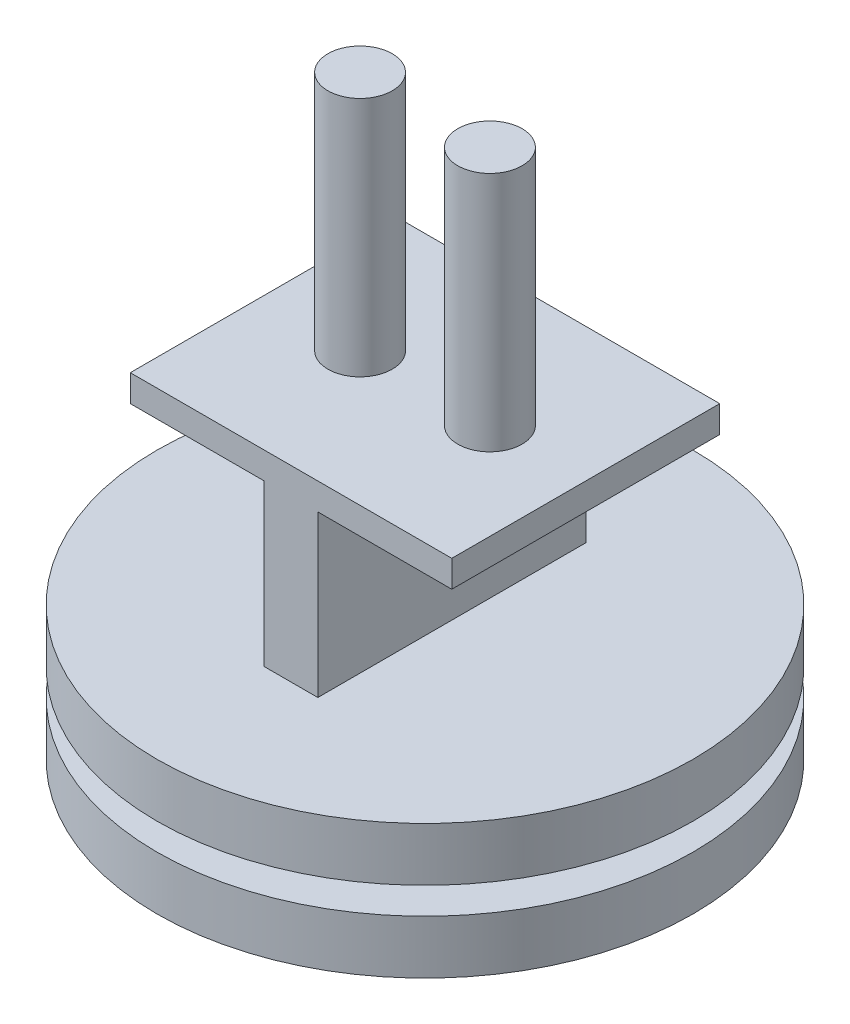
ISO-10303-21;
HEADER;
FILE_DESCRIPTION(('STEP AP214'),'2;1');
FILE_NAME('part.step','',(''),(''),'','','');
FILE_SCHEMA(('AUTOMOTIVE_DESIGN { 1 0 10303 214 1 1 1 1 }'));
ENDSEC;
DATA;
#1=APPLICATION_CONTEXT('core data for automotive mechanical design processes');
#2=APPLICATION_PROTOCOL_DEFINITION('international standard','automotive_design',2000,#1);
#3=PRODUCT_CONTEXT('',#1,'mechanical');
#4=PRODUCT('Part','Part','',(#3));
#5=PRODUCT_RELATED_PRODUCT_CATEGORY('part','',(#4));
#6=PRODUCT_DEFINITION_FORMATION('','',#4);
#7=PRODUCT_DEFINITION_CONTEXT('part definition',#1,'design');
#8=PRODUCT_DEFINITION('design','',#6,#7);
#9=PRODUCT_DEFINITION_SHAPE('','',#8);
#10=(LENGTH_UNIT() NAMED_UNIT(*) SI_UNIT(.MILLI.,.METRE.));
#11=(NAMED_UNIT(*) PLANE_ANGLE_UNIT() SI_UNIT($,.RADIAN.));
#12=(NAMED_UNIT(*) SI_UNIT($,.STERADIAN.) SOLID_ANGLE_UNIT());
#13=UNCERTAINTY_MEASURE_WITH_UNIT(LENGTH_MEASURE(1.E-05),#10,'distance_accuracy_value','');
#14=(GEOMETRIC_REPRESENTATION_CONTEXT(3) GLOBAL_UNCERTAINTY_ASSIGNED_CONTEXT((#13)) GLOBAL_UNIT_ASSIGNED_CONTEXT((#10,
#11,#12)) REPRESENTATION_CONTEXT('',''));
#15=CARTESIAN_POINT('',(0.,0.,0.));
#16=DIRECTION('',(0.,0.,1.));
#17=DIRECTION('',(1.,0.,0.));
#18=AXIS2_PLACEMENT_3D('',#15,#16,#17);
#19=CARTESIAN_POINT('',(0.,10.,0.));
#20=DIRECTION('',(0.,-1.,0.));
#21=DIRECTION('',(0.,0.,-1.));
#22=AXIS2_PLACEMENT_3D('',#19,#20,#21);
#23=CYLINDRICAL_SURFACE('',#22,50.);
#24=CARTESIAN_POINT('',(0.,10.,0.));
#25=DIRECTION('',(0.,1.,0.));
#26=DIRECTION('',(0.,0.,1.));
#27=AXIS2_PLACEMENT_3D('',#24,#25,#26);
#28=CIRCLE('',#27,50.);
#29=CARTESIAN_POINT('',(0.,10.,50.));
#30=VERTEX_POINT('',#29);
#31=EDGE_CURVE('E189',#30,#30,#28,.T.);
#32=ORIENTED_EDGE('',*,*,#31,.F.);
#33=EDGE_LOOP('',(#32));
#34=FACE_BOUND('',#33,.T.);
#35=CARTESIAN_POINT('',(0.,0.,0.));
#36=DIRECTION('',(0.,1.,0.));
#37=DIRECTION('',(0.,0.,1.));
#38=AXIS2_PLACEMENT_3D('',#35,#36,#37);
#39=CIRCLE('',#38,50.);
#40=CARTESIAN_POINT('',(0.,0.,50.));
#41=VERTEX_POINT('',#40);
#42=EDGE_CURVE('E184',#41,#41,#39,.T.);
#43=ORIENTED_EDGE('',*,*,#42,.T.);
#44=EDGE_LOOP('',(#43));
#45=FACE_BOUND('',#44,.T.);
#46=ADVANCED_FACE('F39',(#34,#45),#23,.T.);
#47=CARTESIAN_POINT('',(0.,10.,0.));
#48=DIRECTION('',(0.,1.,0.));
#49=DIRECTION('',(0.,0.,1.));
#50=AXIS2_PLACEMENT_3D('',#47,#48,#49);
#51=PLANE('',#50);
#52=CARTESIAN_POINT('',(0.,10.,0.));
#53=DIRECTION('',(0.,1.,0.));
#54=DIRECTION('',(0.,0.,1.));
#55=AXIS2_PLACEMENT_3D('',#52,#53,#54);
#56=CIRCLE('',#55,10.);
#57=CARTESIAN_POINT('',(0.,10.,10.));
#58=VERTEX_POINT('',#57);
#59=EDGE_CURVE('E185',#58,#58,#56,.T.);
#60=ORIENTED_EDGE('',*,*,#59,.F.);
#61=EDGE_LOOP('',(#60));
#62=FACE_BOUND('',#61,.T.);
#63=ORIENTED_EDGE('',*,*,#31,.T.);
#64=EDGE_LOOP('',(#63));
#65=FACE_BOUND('',#64,.T.);
#66=ADVANCED_FACE('F218',(#62,#65),#51,.T.);
#67=CARTESIAN_POINT('',(0.,0.,0.));
#68=DIRECTION('',(0.,1.,0.));
#69=DIRECTION('',(0.,0.,1.));
#70=AXIS2_PLACEMENT_3D('',#67,#68,#69);
#71=PLANE('',#70);
#72=ORIENTED_EDGE('',*,*,#42,.F.);
#73=EDGE_LOOP('',(#72));
#74=FACE_BOUND('',#73,.T.);
#75=ADVANCED_FACE('F223',(#74),#71,.F.);
#76=CARTESIAN_POINT('',(0.,15.,0.));
#77=DIRECTION('',(0.,-1.,0.));
#78=DIRECTION('',(0.,0.,-1.));
#79=AXIS2_PLACEMENT_3D('',#76,#77,#78);
#80=CYLINDRICAL_SURFACE('',#79,10.);
#81=CARTESIAN_POINT('',(0.,15.,0.));
#82=DIRECTION('',(0.,1.,0.));
#83=DIRECTION('',(0.,0.,1.));
#84=AXIS2_PLACEMENT_3D('',#81,#82,#83);
#85=CIRCLE('',#84,10.);
#86=CARTESIAN_POINT('',(0.,15.,10.));
#87=VERTEX_POINT('',#86);
#88=EDGE_CURVE('E177',#87,#87,#85,.T.);
#89=ORIENTED_EDGE('',*,*,#88,.F.);
#90=EDGE_LOOP('',(#89));
#91=FACE_BOUND('',#90,.T.);
#92=ORIENTED_EDGE('',*,*,#59,.T.);
#93=EDGE_LOOP('',(#92));
#94=FACE_BOUND('',#93,.T.);
#95=ADVANCED_FACE('F231',(#91,#94),#80,.T.);
#96=CARTESIAN_POINT('',(0.,25.,0.));
#97=DIRECTION('',(0.,-1.,0.));
#98=DIRECTION('',(0.,0.,-1.));
#99=AXIS2_PLACEMENT_3D('',#96,#97,#98);
#100=CYLINDRICAL_SURFACE('',#99,50.);
#101=CARTESIAN_POINT('',(0.,25.,0.));
#102=DIRECTION('',(0.,1.,0.));
#103=DIRECTION('',(0.,0.,1.));
#104=AXIS2_PLACEMENT_3D('',#101,#102,#103);
#105=CIRCLE('',#104,50.);
#106=CARTESIAN_POINT('',(0.,25.,50.));
#107=VERTEX_POINT('',#106);
#108=EDGE_CURVE('E173',#107,#107,#105,.T.);
#109=ORIENTED_EDGE('',*,*,#108,.F.);
#110=EDGE_LOOP('',(#109));
#111=FACE_BOUND('',#110,.T.);
#112=CARTESIAN_POINT('',(0.,15.,0.));
#113=DIRECTION('',(0.,1.,0.));
#114=DIRECTION('',(0.,0.,1.));
#115=AXIS2_PLACEMENT_3D('',#112,#113,#114);
#116=CIRCLE('',#115,50.);
#117=CARTESIAN_POINT('',(0.,15.,50.));
#118=VERTEX_POINT('',#117);
#119=EDGE_CURVE('E172',#118,#118,#116,.T.);
#120=ORIENTED_EDGE('',*,*,#119,.T.);
#121=EDGE_LOOP('',(#120));
#122=FACE_BOUND('',#121,.T.);
#123=ADVANCED_FACE('F235',(#111,#122),#100,.T.);
#124=CARTESIAN_POINT('',(0.,25.,0.));
#125=DIRECTION('',(0.,1.,0.));
#126=DIRECTION('',(0.,0.,1.));
#127=AXIS2_PLACEMENT_3D('',#124,#125,#126);
#128=PLANE('',#127);
#129=DIRECTION('',(0.,0.,-1.));
#130=VECTOR('',#129,1.);
#131=CARTESIAN_POINT('',(5.,25.,-25.));
#132=LINE('',#131,#130);
#133=CARTESIAN_POINT('',(5.,25.,25.));
#134=VERTEX_POINT('',#133);
#135=CARTESIAN_POINT('',(5.,25.,-25.));
#136=VERTEX_POINT('',#135);
#137=EDGE_CURVE('E54',#134,#136,#132,.T.);
#138=ORIENTED_EDGE('',*,*,#137,.F.);
#139=DIRECTION('',(1.,0.,0.));
#140=VECTOR('',#139,1.);
#141=CARTESIAN_POINT('',(-4.99999999999999,25.,25.));
#142=LINE('',#141,#140);
#143=CARTESIAN_POINT('',(-4.99999999999999,25.,25.));
#144=VERTEX_POINT('',#143);
#145=EDGE_CURVE('E58',#144,#134,#142,.T.);
#146=ORIENTED_EDGE('',*,*,#145,.F.);
#147=DIRECTION('',(0.,0.,1.));
#148=VECTOR('',#147,1.);
#149=CARTESIAN_POINT('',(-5.,25.,-25.));
#150=LINE('',#149,#148);
#151=CARTESIAN_POINT('',(-5.,25.,-25.));
#152=VERTEX_POINT('',#151);
#153=EDGE_CURVE('E152',#152,#144,#150,.T.);
#154=ORIENTED_EDGE('',*,*,#153,.F.);
#155=DIRECTION('',(-1.,0.,0.));
#156=VECTOR('',#155,1.);
#157=CARTESIAN_POINT('',(-5.,25.,-25.));
#158=LINE('',#157,#156);
#159=EDGE_CURVE('E135',#136,#152,#158,.T.);
#160=ORIENTED_EDGE('',*,*,#159,.F.);
#161=EDGE_LOOP('',(#138,#146,#154,#160));
#162=FACE_BOUND('',#161,.T.);
#163=ORIENTED_EDGE('',*,*,#108,.T.);
#164=EDGE_LOOP('',(#163));
#165=FACE_BOUND('',#164,.T.);
#166=ADVANCED_FACE('F241',(#162,#165),#128,.T.);
#167=CARTESIAN_POINT('',(0.,15.,0.));
#168=DIRECTION('',(0.,1.,0.));
#169=DIRECTION('',(0.,0.,1.));
#170=AXIS2_PLACEMENT_3D('',#167,#168,#169);
#171=PLANE('',#170);
#172=ORIENTED_EDGE('',*,*,#88,.T.);
#173=EDGE_LOOP('',(#172));
#174=FACE_BOUND('',#173,.T.);
#175=ORIENTED_EDGE('',*,*,#119,.F.);
#176=EDGE_LOOP('',(#175));
#177=FACE_BOUND('',#176,.T.);
#178=ADVANCED_FACE('F243',(#174,#177),#171,.F.);
#179=CARTESIAN_POINT('',(5.,55.,-25.));
#180=DIRECTION('',(-1.,0.,0.));
#181=DIRECTION('',(0.,0.,1.));
#182=AXIS2_PLACEMENT_3D('',#179,#180,#181);
#183=PLANE('',#182);
#184=ORIENTED_EDGE('',*,*,#137,.T.);
#185=DIRECTION('',(0.,-1.,0.));
#186=VECTOR('',#185,1.);
#187=CARTESIAN_POINT('',(5.,55.,-25.));
#188=LINE('',#187,#186);
#189=CARTESIAN_POINT('',(5.,55.,-25.));
#190=VERTEX_POINT('',#189);
#191=EDGE_CURVE('E168',#190,#136,#188,.T.);
#192=ORIENTED_EDGE('',*,*,#191,.F.);
#193=DIRECTION('',(0.,0.,-1.));
#194=VECTOR('',#193,1.);
#195=CARTESIAN_POINT('',(5.,55.,-25.));
#196=LINE('',#195,#194);
#197=CARTESIAN_POINT('',(5.,55.,25.));
#198=VERTEX_POINT('',#197);
#199=EDGE_CURVE('E141',#198,#190,#196,.T.);
#200=ORIENTED_EDGE('',*,*,#199,.F.);
#201=DIRECTION('',(0.,-1.,0.));
#202=VECTOR('',#201,1.);
#203=CARTESIAN_POINT('',(5.,55.,25.));
#204=LINE('',#203,#202);
#205=EDGE_CURVE('E148',#198,#134,#204,.T.);
#206=ORIENTED_EDGE('',*,*,#205,.T.);
#207=EDGE_LOOP('',(#184,#192,#200,#206));
#208=FACE_BOUND('',#207,.T.);
#209=ADVANCED_FACE('F246',(#208),#183,.F.);
#210=CARTESIAN_POINT('',(-5.,55.,-25.));
#211=DIRECTION('',(0.,0.,1.));
#212=DIRECTION('',(1.,0.,0.));
#213=AXIS2_PLACEMENT_3D('',#210,#211,#212);
#214=PLANE('',#213);
#215=ORIENTED_EDGE('',*,*,#159,.T.);
#216=DIRECTION('',(0.,-1.,0.));
#217=VECTOR('',#216,1.);
#218=CARTESIAN_POINT('',(-5.,55.,-25.));
#219=LINE('',#218,#217);
#220=CARTESIAN_POINT('',(-5.,55.,-25.));
#221=VERTEX_POINT('',#220);
#222=EDGE_CURVE('E164',#221,#152,#219,.T.);
#223=ORIENTED_EDGE('',*,*,#222,.F.);
#224=DIRECTION('',(-1.,0.,0.));
#225=VECTOR('',#224,1.);
#226=CARTESIAN_POINT('',(-30.,55.,-25.));
#227=LINE('',#226,#225);
#228=CARTESIAN_POINT('',(-30.,55.,-25.));
#229=VERTEX_POINT('',#228);
#230=EDGE_CURVE('E292',#221,#229,#227,.T.);
#231=ORIENTED_EDGE('',*,*,#230,.T.);
#232=DIRECTION('',(0.,-1.,0.));
#233=VECTOR('',#232,1.);
#234=CARTESIAN_POINT('',(-30.,60.,-25.));
#235=LINE('',#234,#233);
#236=CARTESIAN_POINT('',(-30.,60.,-25.));
#237=VERTEX_POINT('',#236);
#238=EDGE_CURVE('E111',#237,#229,#235,.T.);
#239=ORIENTED_EDGE('',*,*,#238,.F.);
#240=DIRECTION('',(-1.,0.,0.));
#241=VECTOR('',#240,1.);
#242=CARTESIAN_POINT('',(-30.,60.,-25.));
#243=LINE('',#242,#241);
#244=CARTESIAN_POINT('',(30.,60.,-25.));
#245=VERTEX_POINT('',#244);
#246=EDGE_CURVE('E102',#245,#237,#243,.T.);
#247=ORIENTED_EDGE('',*,*,#246,.F.);
#248=DIRECTION('',(0.,-1.,0.));
#249=VECTOR('',#248,1.);
#250=CARTESIAN_POINT('',(30.,60.,-25.));
#251=LINE('',#250,#249);
#252=CARTESIAN_POINT('',(30.,55.,-25.));
#253=VERTEX_POINT('',#252);
#254=EDGE_CURVE('E108',#245,#253,#251,.T.);
#255=ORIENTED_EDGE('',*,*,#254,.T.);
#256=EDGE_CURVE('E279',#253,#190,#227,.T.);
#257=ORIENTED_EDGE('',*,*,#256,.T.);
#258=ORIENTED_EDGE('',*,*,#191,.T.);
#259=EDGE_LOOP('',(#215,#223,#231,#239,#247,#255,#257,#258));
#260=FACE_BOUND('',#259,.T.);
#261=ADVANCED_FACE('F105',(#260),#214,.F.);
#262=CARTESIAN_POINT('',(-5.,55.,-25.));
#263=DIRECTION('',(1.,0.,0.));
#264=DIRECTION('',(0.,0.,-1.));
#265=AXIS2_PLACEMENT_3D('',#262,#263,#264);
#266=PLANE('',#265);
#267=ORIENTED_EDGE('',*,*,#153,.T.);
#268=DIRECTION('',(0.,-1.,0.));
#269=VECTOR('',#268,1.);
#270=CARTESIAN_POINT('',(-4.99999999999999,55.,25.));
#271=LINE('',#270,#269);
#272=CARTESIAN_POINT('',(-5.,55.,25.));
#273=VERTEX_POINT('',#272);
#274=EDGE_CURVE('E160',#273,#144,#271,.T.);
#275=ORIENTED_EDGE('',*,*,#274,.F.);
#276=DIRECTION('',(0.,0.,1.));
#277=VECTOR('',#276,1.);
#278=CARTESIAN_POINT('',(-5.,55.,-25.));
#279=LINE('',#278,#277);
#280=EDGE_CURVE('E145',#221,#273,#279,.T.);
#281=ORIENTED_EDGE('',*,*,#280,.F.);
#282=ORIENTED_EDGE('',*,*,#222,.T.);
#283=EDGE_LOOP('',(#267,#275,#281,#282));
#284=FACE_BOUND('',#283,.T.);
#285=ADVANCED_FACE('F255',(#284),#266,.F.);
#286=CARTESIAN_POINT('',(-4.99999999999999,55.,25.));
#287=DIRECTION('',(0.,0.,-1.));
#288=DIRECTION('',(-1.,0.,0.));
#289=AXIS2_PLACEMENT_3D('',#286,#287,#288);
#290=PLANE('',#289);
#291=ORIENTED_EDGE('',*,*,#145,.T.);
#292=ORIENTED_EDGE('',*,*,#205,.F.);
#293=DIRECTION('',(1.,0.,0.));
#294=VECTOR('',#293,1.);
#295=CARTESIAN_POINT('',(-30.,55.,25.));
#296=LINE('',#295,#294);
#297=CARTESIAN_POINT('',(30.,55.,25.));
#298=VERTEX_POINT('',#297);
#299=EDGE_CURVE('E271',#198,#298,#296,.T.);
#300=ORIENTED_EDGE('',*,*,#299,.T.);
#301=DIRECTION('',(0.,-1.,0.));
#302=VECTOR('',#301,1.);
#303=CARTESIAN_POINT('',(30.,60.,25.));
#304=LINE('',#303,#302);
#305=CARTESIAN_POINT('',(30.,60.,25.));
#306=VERTEX_POINT('',#305);
#307=EDGE_CURVE('E283',#306,#298,#304,.T.);
#308=ORIENTED_EDGE('',*,*,#307,.F.);
#309=DIRECTION('',(1.,0.,0.));
#310=VECTOR('',#309,1.);
#311=CARTESIAN_POINT('',(-30.,60.,25.));
#312=LINE('',#311,#310);
#313=CARTESIAN_POINT('',(-30.,60.,25.));
#314=VERTEX_POINT('',#313);
#315=EDGE_CURVE('E121',#314,#306,#312,.T.);
#316=ORIENTED_EDGE('',*,*,#315,.F.);
#317=DIRECTION('',(0.,-1.,0.));
#318=VECTOR('',#317,1.);
#319=CARTESIAN_POINT('',(-30.,60.,25.));
#320=LINE('',#319,#318);
#321=CARTESIAN_POINT('',(-30.,55.,25.));
#322=VERTEX_POINT('',#321);
#323=EDGE_CURVE('E137',#314,#322,#320,.T.);
#324=ORIENTED_EDGE('',*,*,#323,.T.);
#325=EDGE_CURVE('E126',#322,#273,#296,.T.);
#326=ORIENTED_EDGE('',*,*,#325,.T.);
#327=ORIENTED_EDGE('',*,*,#274,.T.);
#328=EDGE_LOOP('',(#291,#292,#300,#308,#316,#324,#326,#327));
#329=FACE_BOUND('',#328,.T.);
#330=ADVANCED_FACE('F258',(#329),#290,.F.);
#331=CARTESIAN_POINT('',(0.,55.,0.));
#332=DIRECTION('',(0.,-1.,0.));
#333=DIRECTION('',(0.,0.,-1.));
#334=AXIS2_PLACEMENT_3D('',#331,#332,#333);
#335=PLANE('',#334);
#336=ORIENTED_EDGE('',*,*,#299,.F.);
#337=ORIENTED_EDGE('',*,*,#199,.T.);
#338=ORIENTED_EDGE('',*,*,#256,.F.);
#339=DIRECTION('',(0.,0.,-1.));
#340=VECTOR('',#339,1.);
#341=CARTESIAN_POINT('',(30.,55.,25.));
#342=LINE('',#341,#340);
#343=EDGE_CURVE('E130',#298,#253,#342,.T.);
#344=ORIENTED_EDGE('',*,*,#343,.F.);
#345=EDGE_LOOP('',(#336,#337,#338,#344));
#346=FACE_BOUND('',#345,.T.);
#347=ADVANCED_FACE('F212',(#346),#335,.T.);
#348=CARTESIAN_POINT('',(30.,60.,25.));
#349=DIRECTION('',(-1.,0.,0.));
#350=DIRECTION('',(0.,0.,1.));
#351=AXIS2_PLACEMENT_3D('',#348,#349,#350);
#352=PLANE('',#351);
#353=ORIENTED_EDGE('',*,*,#343,.T.);
#354=ORIENTED_EDGE('',*,*,#254,.F.);
#355=DIRECTION('',(0.,0.,-1.));
#356=VECTOR('',#355,1.);
#357=CARTESIAN_POINT('',(30.,60.,25.));
#358=LINE('',#357,#356);
#359=EDGE_CURVE('E116',#306,#245,#358,.T.);
#360=ORIENTED_EDGE('',*,*,#359,.F.);
#361=ORIENTED_EDGE('',*,*,#307,.T.);
#362=EDGE_LOOP('',(#353,#354,#360,#361));
#363=FACE_BOUND('',#362,.T.);
#364=ADVANCED_FACE('F128',(#363),#352,.F.);
#365=CARTESIAN_POINT('',(-30.,60.,25.));
#366=DIRECTION('',(1.,0.,0.));
#367=DIRECTION('',(0.,0.,-1.));
#368=AXIS2_PLACEMENT_3D('',#365,#366,#367);
#369=PLANE('',#368);
#370=DIRECTION('',(0.,0.,1.));
#371=VECTOR('',#370,1.);
#372=CARTESIAN_POINT('',(-30.,55.,25.));
#373=LINE('',#372,#371);
#374=EDGE_CURVE('E274',#229,#322,#373,.T.);
#375=ORIENTED_EDGE('',*,*,#374,.T.);
#376=ORIENTED_EDGE('',*,*,#323,.F.);
#377=DIRECTION('',(0.,0.,1.));
#378=VECTOR('',#377,1.);
#379=CARTESIAN_POINT('',(-30.,60.,25.));
#380=LINE('',#379,#378);
#381=EDGE_CURVE('E115',#237,#314,#380,.T.);
#382=ORIENTED_EDGE('',*,*,#381,.F.);
#383=ORIENTED_EDGE('',*,*,#238,.T.);
#384=EDGE_LOOP('',(#375,#376,#382,#383));
#385=FACE_BOUND('',#384,.T.);
#386=ADVANCED_FACE('F203',(#385),#369,.F.);
#387=CARTESIAN_POINT('',(0.,60.,0.));
#388=DIRECTION('',(0.,-1.,0.));
#389=DIRECTION('',(0.,0.,-1.));
#390=AXIS2_PLACEMENT_3D('',#387,#388,#389);
#391=PLANE('',#390);
#392=CARTESIAN_POINT('',(-12.1181856013317,60.,0.));
#393=DIRECTION('',(0.,-1.,0.));
#394=DIRECTION('',(0.,0.,-1.));
#395=AXIS2_PLACEMENT_3D('',#392,#393,#394);
#396=CIRCLE('',#395,6.);
#397=CARTESIAN_POINT('',(-12.1181856013317,60.,-6.));
#398=VERTEX_POINT('',#397);
#399=EDGE_CURVE('E11',#398,#398,#396,.F.);
#400=ORIENTED_EDGE('',*,*,#399,.F.);
#401=EDGE_LOOP('',(#400));
#402=FACE_BOUND('',#401,.T.);
#403=CARTESIAN_POINT('',(12.1181856013317,60.,0.));
#404=DIRECTION('',(0.,-1.,0.));
#405=DIRECTION('',(0.,0.,-1.));
#406=AXIS2_PLACEMENT_3D('',#403,#404,#405);
#407=CIRCLE('',#406,6.);
#408=CARTESIAN_POINT('',(12.1181856013317,60.,-6.));
#409=VERTEX_POINT('',#408);
#410=EDGE_CURVE('E47',#409,#409,#407,.F.);
#411=ORIENTED_EDGE('',*,*,#410,.F.);
#412=EDGE_LOOP('',(#411));
#413=FACE_BOUND('',#412,.T.);
#414=ORIENTED_EDGE('',*,*,#359,.T.);
#415=ORIENTED_EDGE('',*,*,#246,.T.);
#416=ORIENTED_EDGE('',*,*,#381,.T.);
#417=ORIENTED_EDGE('',*,*,#315,.T.);
#418=EDGE_LOOP('',(#414,#415,#416,#417));
#419=FACE_BOUND('',#418,.T.);
#420=ADVANCED_FACE('F119',(#402,#413,#419),#391,.F.);
#421=ORIENTED_EDGE('',*,*,#230,.F.);
#422=ORIENTED_EDGE('',*,*,#280,.T.);
#423=ORIENTED_EDGE('',*,*,#325,.F.);
#424=ORIENTED_EDGE('',*,*,#374,.F.);
#425=EDGE_LOOP('',(#421,#422,#423,#424));
#426=FACE_BOUND('',#425,.T.);
#427=ADVANCED_FACE('F202',(#426),#335,.T.);
#428=CARTESIAN_POINT('',(12.1181856013317,105.,0.));
#429=DIRECTION('',(0.,-1.,0.));
#430=DIRECTION('',(0.,0.,-1.));
#431=AXIS2_PLACEMENT_3D('',#428,#429,#430);
#432=CYLINDRICAL_SURFACE('',#431,6.);
#433=CARTESIAN_POINT('',(12.1181856013317,105.,0.));
#434=DIRECTION('',(0.,1.,0.));
#435=DIRECTION('',(0.,0.,1.));
#436=AXIS2_PLACEMENT_3D('',#433,#434,#435);
#437=CIRCLE('',#436,6.);
#438=CARTESIAN_POINT('',(12.1181856013317,105.,-6.));
#439=VERTEX_POINT('',#438);
#440=EDGE_CURVE('E298',#439,#439,#437,.T.);
#441=CARTESIAN_POINT('',(12.1181856013317,105.,-6.));
#442=CARTESIAN_POINT('',(12.1181856013317,104.53125,-6.));
#443=CARTESIAN_POINT('',(12.1181856013317,104.0625,-6.));
#444=CARTESIAN_POINT('',(12.1181856013317,103.125,-6.));
#445=CARTESIAN_POINT('',(12.1181856013317,102.65625,-6.));
#446=CARTESIAN_POINT('',(12.1181856013317,101.71875,-6.));
#447=CARTESIAN_POINT('',(12.1181856013317,101.25,-6.));
#448=CARTESIAN_POINT('',(12.1181856013317,100.3125,-6.));
#449=CARTESIAN_POINT('',(12.1181856013317,99.84375,-6.));
#450=CARTESIAN_POINT('',(12.1181856013317,98.90625,-6.));
#451=CARTESIAN_POINT('',(12.1181856013317,98.4375,-6.));
#452=CARTESIAN_POINT('',(12.1181856013317,97.5,-6.));
#453=CARTESIAN_POINT('',(12.1181856013317,97.03125,-6.));
#454=CARTESIAN_POINT('',(12.1181856013317,96.09375,-6.));
#455=CARTESIAN_POINT('',(12.1181856013317,95.625,-6.));
#456=CARTESIAN_POINT('',(12.1181856013317,94.6875,-6.));
#457=CARTESIAN_POINT('',(12.1181856013317,94.21875,-6.));
#458=CARTESIAN_POINT('',(12.1181856013317,93.28125,-6.));
#459=CARTESIAN_POINT('',(12.1181856013317,92.8125,-6.));
#460=CARTESIAN_POINT('',(12.1181856013317,91.875,-6.));
#461=CARTESIAN_POINT('',(12.1181856013317,91.40625,-6.));
#462=CARTESIAN_POINT('',(12.1181856013317,90.46875,-6.));
#463=CARTESIAN_POINT('',(12.1181856013317,90.,-6.));
#464=CARTESIAN_POINT('',(12.1181856013317,89.0625,-6.));
#465=CARTESIAN_POINT('',(12.1181856013317,88.59375,-6.));
#466=CARTESIAN_POINT('',(12.1181856013317,87.65625,-6.));
#467=CARTESIAN_POINT('',(12.1181856013317,87.1875,-6.));
#468=CARTESIAN_POINT('',(12.1181856013317,86.25,-6.));
#469=CARTESIAN_POINT('',(12.1181856013317,85.78125,-6.));
#470=CARTESIAN_POINT('',(12.1181856013317,84.84375,-6.));
#471=CARTESIAN_POINT('',(12.1181856013317,84.375,-6.));
#472=CARTESIAN_POINT('',(12.1181856013317,83.4375,-6.));
#473=CARTESIAN_POINT('',(12.1181856013317,82.96875,-6.));
#474=CARTESIAN_POINT('',(12.1181856013317,82.03125,-6.));
#475=CARTESIAN_POINT('',(12.1181856013317,81.5625,-6.));
#476=CARTESIAN_POINT('',(12.1181856013317,80.625,-6.));
#477=CARTESIAN_POINT('',(12.1181856013317,80.15625,-6.));
#478=CARTESIAN_POINT('',(12.1181856013317,79.21875,-6.));
#479=CARTESIAN_POINT('',(12.1181856013317,78.75,-6.));
#480=CARTESIAN_POINT('',(12.1181856013317,77.8125,-6.));
#481=CARTESIAN_POINT('',(12.1181856013317,77.34375,-6.));
#482=CARTESIAN_POINT('',(12.1181856013317,76.40625,-6.));
#483=CARTESIAN_POINT('',(12.1181856013317,75.9375,-6.));
#484=CARTESIAN_POINT('',(12.1181856013317,75.,-6.));
#485=CARTESIAN_POINT('',(12.1181856013317,74.53125,-6.));
#486=CARTESIAN_POINT('',(12.1181856013317,73.59375,-6.));
#487=CARTESIAN_POINT('',(12.1181856013317,73.125,-6.));
#488=CARTESIAN_POINT('',(12.1181856013317,72.1875,-6.));
#489=CARTESIAN_POINT('',(12.1181856013317,71.71875,-6.));
#490=CARTESIAN_POINT('',(12.1181856013317,70.78125,-6.));
#491=CARTESIAN_POINT('',(12.1181856013317,70.3125,-6.));
#492=CARTESIAN_POINT('',(12.1181856013317,69.375,-6.));
#493=CARTESIAN_POINT('',(12.1181856013317,68.90625,-6.));
#494=CARTESIAN_POINT('',(12.1181856013317,67.96875,-6.));
#495=CARTESIAN_POINT('',(12.1181856013317,67.5,-6.));
#496=CARTESIAN_POINT('',(12.1181856013317,66.5625,-6.));
#497=CARTESIAN_POINT('',(12.1181856013317,66.09375,-6.));
#498=CARTESIAN_POINT('',(12.1181856013317,65.15625,-6.));
#499=CARTESIAN_POINT('',(12.1181856013317,64.6875,-6.));
#500=CARTESIAN_POINT('',(12.1181856013317,63.75,-6.));
#501=CARTESIAN_POINT('',(12.1181856013317,63.28125,-6.));
#502=CARTESIAN_POINT('',(12.1181856013317,62.34375,-6.));
#503=CARTESIAN_POINT('',(12.1181856013317,61.875,-6.));
#504=CARTESIAN_POINT('',(12.1181856013317,60.9375,-6.));
#505=CARTESIAN_POINT('',(12.1181856013317,60.46875,-6.));
#506=CARTESIAN_POINT('',(12.1181856013317,60.,-6.));
#507=B_SPLINE_CURVE_WITH_KNOTS('',3,(#441,#442,#443,#444,#445,#446,#447,#448,#449,#450,#451,
#452,#453,#454,#455,#456,#457,#458,#459,#460,#461,#462,#463,#464,#465,#466,#467,#468,#469,#470,
#471,#472,#473,#474,#475,#476,#477,#478,#479,#480,#481,#482,#483,#484,#485,#486,#487,#488,#489,
#490,#491,#492,#493,#494,#495,#496,#497,#498,#499,#500,#501,#502,#503,#504,#505,#506),
.UNSPECIFIED.,.F.,.F.,(4,2,2,2,2,2,2,2,2,2,2,2,2,2,2,2,2,2,2,2,2,2,2,2,2,2,2,2,2,2,2,2,4),(0.,
1.40625000000001,2.81250000000001,4.21875000000001,5.62500000000001,7.03125,8.4375,
9.84375000000001,11.25,12.65625,14.0625,15.46875,16.875,18.28125,19.6875,21.09375,22.5,23.90625,
25.3125,26.71875,28.125,29.53125,30.9375,32.34375,33.75,35.15625,36.5625,37.96875,39.375,
40.78125,42.1875,43.59375,45.),.UNSPECIFIED.);
#508=EDGE_CURVE('BSEAM199',#439,#409,#507,.T.);
#509=ORIENTED_EDGE('',*,*,#440,.F.);
#510=ORIENTED_EDGE('',*,*,#410,.T.);
#511=ORIENTED_EDGE('',*,*,#508,.T.);
#512=ORIENTED_EDGE('',*,*,#508,.F.);
#513=EDGE_LOOP('',(#509,#511,#510,#512));
#514=FACE_BOUND('',#513,.T.);
#515=ADVANCED_FACE('F199',(#514),#432,.T.);
#516=CARTESIAN_POINT('',(12.1181856013317,105.,0.));
#517=DIRECTION('',(0.,1.,0.));
#518=DIRECTION('',(0.,0.,1.));
#519=AXIS2_PLACEMENT_3D('',#516,#517,#518);
#520=PLANE('',#519);
#521=ORIENTED_EDGE('',*,*,#440,.T.);
#522=EDGE_LOOP('',(#521));
#523=FACE_BOUND('',#522,.T.);
#524=ADVANCED_FACE('F316',(#523),#520,.T.);
#525=CARTESIAN_POINT('',(-12.1181856013317,105.,0.));
#526=DIRECTION('',(0.,-1.,0.));
#527=DIRECTION('',(0.,0.,-1.));
#528=AXIS2_PLACEMENT_3D('',#525,#526,#527);
#529=CYLINDRICAL_SURFACE('',#528,6.);
#530=CARTESIAN_POINT('',(-12.1181856013317,105.,0.));
#531=DIRECTION('',(0.,1.,0.));
#532=DIRECTION('',(0.,0.,-1.));
#533=AXIS2_PLACEMENT_3D('',#530,#531,#532);
#534=CIRCLE('',#533,6.);
#535=CARTESIAN_POINT('',(-12.1181856013317,105.,-6.));
#536=VERTEX_POINT('',#535);
#537=EDGE_CURVE('E306',#536,#536,#534,.T.);
#538=CARTESIAN_POINT('',(-12.1181856013317,105.,-6.));
#539=CARTESIAN_POINT('',(-12.1181856013317,104.53125,-6.));
#540=CARTESIAN_POINT('',(-12.1181856013317,104.0625,-6.));
#541=CARTESIAN_POINT('',(-12.1181856013317,103.125,-6.));
#542=CARTESIAN_POINT('',(-12.1181856013317,102.65625,-6.));
#543=CARTESIAN_POINT('',(-12.1181856013317,101.71875,-6.));
#544=CARTESIAN_POINT('',(-12.1181856013317,101.25,-6.));
#545=CARTESIAN_POINT('',(-12.1181856013317,100.3125,-6.));
#546=CARTESIAN_POINT('',(-12.1181856013317,99.84375,-6.));
#547=CARTESIAN_POINT('',(-12.1181856013317,98.90625,-6.));
#548=CARTESIAN_POINT('',(-12.1181856013317,98.4375,-6.));
#549=CARTESIAN_POINT('',(-12.1181856013317,97.5,-6.));
#550=CARTESIAN_POINT('',(-12.1181856013317,97.03125,-6.));
#551=CARTESIAN_POINT('',(-12.1181856013317,96.09375,-6.));
#552=CARTESIAN_POINT('',(-12.1181856013317,95.625,-6.));
#553=CARTESIAN_POINT('',(-12.1181856013317,94.6875,-6.));
#554=CARTESIAN_POINT('',(-12.1181856013317,94.21875,-6.));
#555=CARTESIAN_POINT('',(-12.1181856013317,93.28125,-6.));
#556=CARTESIAN_POINT('',(-12.1181856013317,92.8125,-6.));
#557=CARTESIAN_POINT('',(-12.1181856013317,91.875,-6.));
#558=CARTESIAN_POINT('',(-12.1181856013317,91.40625,-6.));
#559=CARTESIAN_POINT('',(-12.1181856013317,90.46875,-6.));
#560=CARTESIAN_POINT('',(-12.1181856013317,90.,-6.));
#561=CARTESIAN_POINT('',(-12.1181856013317,89.0625,-6.));
#562=CARTESIAN_POINT('',(-12.1181856013317,88.59375,-6.));
#563=CARTESIAN_POINT('',(-12.1181856013317,87.65625,-6.));
#564=CARTESIAN_POINT('',(-12.1181856013317,87.1875,-6.));
#565=CARTESIAN_POINT('',(-12.1181856013317,86.25,-6.));
#566=CARTESIAN_POINT('',(-12.1181856013317,85.78125,-6.));
#567=CARTESIAN_POINT('',(-12.1181856013317,84.84375,-6.));
#568=CARTESIAN_POINT('',(-12.1181856013317,84.375,-6.));
#569=CARTESIAN_POINT('',(-12.1181856013317,83.4375,-6.));
#570=CARTESIAN_POINT('',(-12.1181856013317,82.96875,-6.));
#571=CARTESIAN_POINT('',(-12.1181856013317,82.03125,-6.));
#572=CARTESIAN_POINT('',(-12.1181856013317,81.5625,-6.));
#573=CARTESIAN_POINT('',(-12.1181856013317,80.625,-6.));
#574=CARTESIAN_POINT('',(-12.1181856013317,80.15625,-6.));
#575=CARTESIAN_POINT('',(-12.1181856013317,79.21875,-6.));
#576=CARTESIAN_POINT('',(-12.1181856013317,78.75,-6.));
#577=CARTESIAN_POINT('',(-12.1181856013317,77.8125,-6.));
#578=CARTESIAN_POINT('',(-12.1181856013317,77.34375,-6.));
#579=CARTESIAN_POINT('',(-12.1181856013317,76.40625,-6.));
#580=CARTESIAN_POINT('',(-12.1181856013317,75.9375,-6.));
#581=CARTESIAN_POINT('',(-12.1181856013317,75.,-6.));
#582=CARTESIAN_POINT('',(-12.1181856013317,74.53125,-6.));
#583=CARTESIAN_POINT('',(-12.1181856013317,73.59375,-6.));
#584=CARTESIAN_POINT('',(-12.1181856013317,73.125,-6.));
#585=CARTESIAN_POINT('',(-12.1181856013317,72.1875,-6.));
#586=CARTESIAN_POINT('',(-12.1181856013317,71.71875,-6.));
#587=CARTESIAN_POINT('',(-12.1181856013317,70.78125,-6.));
#588=CARTESIAN_POINT('',(-12.1181856013317,70.3125,-6.));
#589=CARTESIAN_POINT('',(-12.1181856013317,69.375,-6.));
#590=CARTESIAN_POINT('',(-12.1181856013317,68.90625,-6.));
#591=CARTESIAN_POINT('',(-12.1181856013317,67.96875,-6.));
#592=CARTESIAN_POINT('',(-12.1181856013317,67.5,-6.));
#593=CARTESIAN_POINT('',(-12.1181856013317,66.5625,-6.));
#594=CARTESIAN_POINT('',(-12.1181856013317,66.09375,-6.));
#595=CARTESIAN_POINT('',(-12.1181856013317,65.15625,-6.));
#596=CARTESIAN_POINT('',(-12.1181856013317,64.6875,-6.));
#597=CARTESIAN_POINT('',(-12.1181856013317,63.75,-6.));
#598=CARTESIAN_POINT('',(-12.1181856013317,63.28125,-6.));
#599=CARTESIAN_POINT('',(-12.1181856013317,62.34375,-6.));
#600=CARTESIAN_POINT('',(-12.1181856013317,61.875,-6.));
#601=CARTESIAN_POINT('',(-12.1181856013317,60.9375,-6.));
#602=CARTESIAN_POINT('',(-12.1181856013317,60.46875,-6.));
#603=CARTESIAN_POINT('',(-12.1181856013317,60.,-6.));
#604=B_SPLINE_CURVE_WITH_KNOTS('',3,(#538,#539,#540,#541,#542,#543,#544,#545,#546,#547,#548,
#549,#550,#551,#552,#553,#554,#555,#556,#557,#558,#559,#560,#561,#562,#563,#564,#565,#566,#567,
#568,#569,#570,#571,#572,#573,#574,#575,#576,#577,#578,#579,#580,#581,#582,#583,#584,#585,#586,
#587,#588,#589,#590,#591,#592,#593,#594,#595,#596,#597,#598,#599,#600,#601,#602,#603),
.UNSPECIFIED.,.F.,.F.,(4,2,2,2,2,2,2,2,2,2,2,2,2,2,2,2,2,2,2,2,2,2,2,2,2,2,2,2,2,2,2,2,4),(0.,
1.40625000000001,2.81250000000001,4.21875000000001,5.62500000000001,7.03125,8.4375,
9.84375000000001,11.25,12.65625,14.0625,15.46875,16.875,18.28125,19.6875,21.09375,22.5,23.90625,
25.3125,26.71875,28.125,29.53125,30.9375,32.34375,33.75,35.15625,36.5625,37.96875,39.375,
40.78125,42.1875,43.59375,45.),.UNSPECIFIED.);
#605=EDGE_CURVE('BSEAM313',#536,#398,#604,.T.);
#606=ORIENTED_EDGE('',*,*,#537,.F.);
#607=ORIENTED_EDGE('',*,*,#399,.T.);
#608=ORIENTED_EDGE('',*,*,#605,.T.);
#609=ORIENTED_EDGE('',*,*,#605,.F.);
#610=EDGE_LOOP('',(#606,#608,#607,#609));
#611=FACE_BOUND('',#610,.T.);
#612=ADVANCED_FACE('F313',(#611),#529,.T.);
#613=CARTESIAN_POINT('',(-12.1181856013317,105.,0.));
#614=DIRECTION('',(0.,-1.,0.));
#615=DIRECTION('',(0.,0.,-1.));
#616=AXIS2_PLACEMENT_3D('',#613,#614,#615);
#617=PLANE('',#616);
#618=ORIENTED_EDGE('',*,*,#537,.T.);
#619=EDGE_LOOP('',(#618));
#620=FACE_BOUND('',#619,.T.);
#621=ADVANCED_FACE('F311',(#620),#617,.F.);
#622=CLOSED_SHELL('',(#46,#66,#75,#95,#123,#166,#178,#209,#261,#285,#330,#347,#364,#386,#420,
#427,#515,#524,#612,#621));
#623=MANIFOLD_SOLID_BREP('B2',#622);
#624=ADVANCED_BREP_SHAPE_REPRESENTATION('',(#18,#623),#14);
#625=SHAPE_DEFINITION_REPRESENTATION(#9,#624);
ENDSEC;
END-ISO-10303-21;
